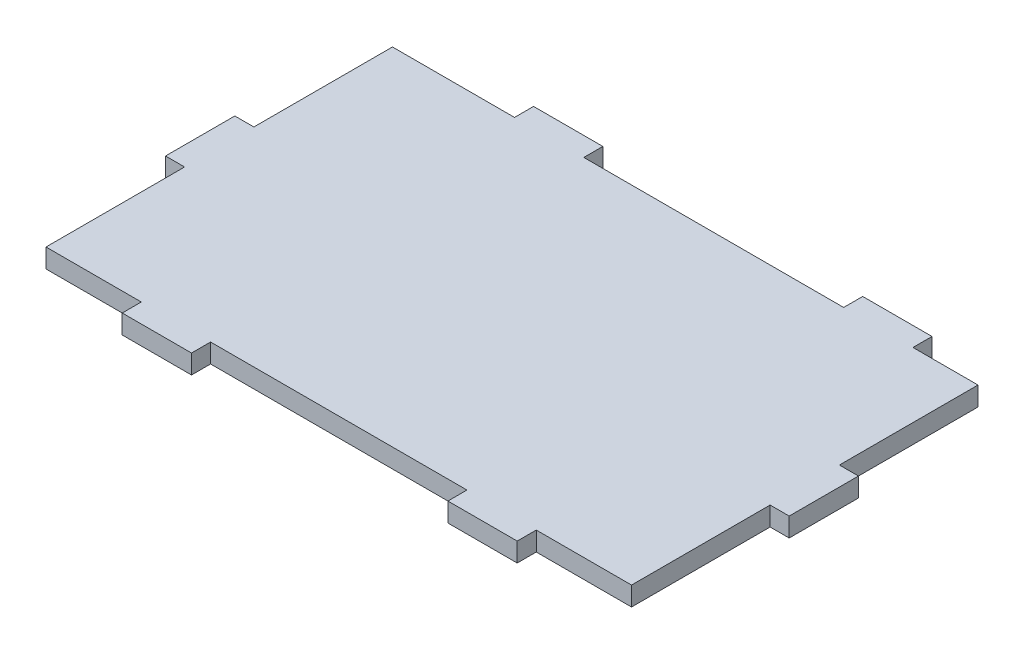
ISO-10303-21;
HEADER;
FILE_DESCRIPTION(('STEP AP214'),'2;1');
FILE_NAME('part.step','',(''),(''),'','','');
FILE_SCHEMA(('AUTOMOTIVE_DESIGN { 1 0 10303 214 1 1 1 1 }'));
ENDSEC;
DATA;
#1=APPLICATION_CONTEXT('core data for automotive mechanical design processes');
#2=APPLICATION_PROTOCOL_DEFINITION('international standard','automotive_design',2000,#1);
#3=PRODUCT_CONTEXT('',#1,'mechanical');
#4=PRODUCT('Part','Part','',(#3));
#5=PRODUCT_RELATED_PRODUCT_CATEGORY('part','',(#4));
#6=PRODUCT_DEFINITION_FORMATION('','',#4);
#7=PRODUCT_DEFINITION_CONTEXT('part definition',#1,'design');
#8=PRODUCT_DEFINITION('design','',#6,#7);
#9=PRODUCT_DEFINITION_SHAPE('','',#8);
#10=(LENGTH_UNIT() NAMED_UNIT(*) SI_UNIT(.MILLI.,.METRE.));
#11=(NAMED_UNIT(*) PLANE_ANGLE_UNIT() SI_UNIT($,.RADIAN.));
#12=(NAMED_UNIT(*) SI_UNIT($,.STERADIAN.) SOLID_ANGLE_UNIT());
#13=UNCERTAINTY_MEASURE_WITH_UNIT(LENGTH_MEASURE(1.E-05),#10,'distance_accuracy_value','');
#14=(GEOMETRIC_REPRESENTATION_CONTEXT(3) GLOBAL_UNCERTAINTY_ASSIGNED_CONTEXT((#13)) GLOBAL_UNIT_ASSIGNED_CONTEXT((#10,
#11,#12)) REPRESENTATION_CONTEXT('',''));
#15=CARTESIAN_POINT('',(0.,0.,0.));
#16=DIRECTION('',(0.,0.,1.));
#17=DIRECTION('',(1.,0.,0.));
#18=AXIS2_PLACEMENT_3D('',#15,#16,#17);
#19=CARTESIAN_POINT('',(180.,5.5,0.));
#20=DIRECTION('',(1.,0.,0.));
#21=DIRECTION('',(0.,0.,-1.));
#22=AXIS2_PLACEMENT_3D('',#19,#20,#21);
#23=PLANE('',#22);
#24=DIRECTION('',(0.,0.,1.));
#25=VECTOR('',#24,1.);
#26=CARTESIAN_POINT('',(180.,0.,0.));
#27=LINE('',#26,#25);
#28=CARTESIAN_POINT('',(180.,0.,-64.4999999999886));
#29=VERTEX_POINT('',#28);
#30=CARTESIAN_POINT('',(180.,0.,-44.4999999999886));
#31=VERTEX_POINT('',#30);
#32=EDGE_CURVE('E259',#29,#31,#27,.T.);
#33=ORIENTED_EDGE('',*,*,#32,.F.);
#34=DIRECTION('',(0.,-1.,0.));
#35=VECTOR('',#34,1.);
#36=CARTESIAN_POINT('',(180.,5.5,-64.4999999999886));
#37=LINE('',#36,#35);
#38=CARTESIAN_POINT('',(180.,5.5,-64.4999999999886));
#39=VERTEX_POINT('',#38);
#40=EDGE_CURVE('E11',#39,#29,#37,.T.);
#41=ORIENTED_EDGE('',*,*,#40,.F.);
#42=DIRECTION('',(0.,0.,1.));
#43=VECTOR('',#42,1.);
#44=CARTESIAN_POINT('',(180.,5.5,0.));
#45=LINE('',#44,#43);
#46=CARTESIAN_POINT('',(180.,5.5,-44.4999999999886));
#47=VERTEX_POINT('',#46);
#48=EDGE_CURVE('E333',#39,#47,#45,.T.);
#49=ORIENTED_EDGE('',*,*,#48,.T.);
#50=DIRECTION('',(0.,-1.,0.));
#51=VECTOR('',#50,1.);
#52=CARTESIAN_POINT('',(180.,5.5,-44.4999999999886));
#53=LINE('',#52,#51);
#54=EDGE_CURVE('E158',#47,#31,#53,.T.);
#55=ORIENTED_EDGE('',*,*,#54,.T.);
#56=EDGE_LOOP('',(#33,#41,#49,#55));
#57=FACE_BOUND('',#56,.T.);
#58=ADVANCED_FACE('F47',(#57),#23,.T.);
#59=CARTESIAN_POINT('',(0.,5.5,-64.4999999999886));
#60=DIRECTION('',(0.,0.,-1.));
#61=DIRECTION('',(-1.,0.,0.));
#62=AXIS2_PLACEMENT_3D('',#59,#60,#61);
#63=PLANE('',#62);
#64=DIRECTION('',(1.,0.,0.));
#65=VECTOR('',#64,1.);
#66=CARTESIAN_POINT('',(0.,0.,-64.4999999999886));
#67=LINE('',#66,#65);
#68=CARTESIAN_POINT('',(174.5,0.,-64.4999999999886));
#69=VERTEX_POINT('',#68);
#70=EDGE_CURVE('E262',#69,#29,#67,.T.);
#71=ORIENTED_EDGE('',*,*,#70,.F.);
#72=DIRECTION('',(0.,-1.,0.));
#73=VECTOR('',#72,1.);
#74=CARTESIAN_POINT('',(174.5,5.5,-64.4999999999886));
#75=LINE('',#74,#73);
#76=CARTESIAN_POINT('',(174.5,5.5,-64.4999999999886));
#77=VERTEX_POINT('',#76);
#78=EDGE_CURVE('E55',#77,#69,#75,.T.);
#79=ORIENTED_EDGE('',*,*,#78,.F.);
#80=DIRECTION('',(1.,0.,0.));
#81=VECTOR('',#80,1.);
#82=CARTESIAN_POINT('',(0.,5.5,-64.4999999999886));
#83=LINE('',#82,#81);
#84=EDGE_CURVE('E398',#77,#39,#83,.T.);
#85=ORIENTED_EDGE('',*,*,#84,.T.);
#86=ORIENTED_EDGE('',*,*,#40,.T.);
#87=EDGE_LOOP('',(#71,#79,#85,#86));
#88=FACE_BOUND('',#87,.T.);
#89=ADVANCED_FACE('F397',(#88),#63,.T.);
#90=CARTESIAN_POINT('',(174.5,5.5,0.));
#91=DIRECTION('',(-1.,0.,0.));
#92=DIRECTION('',(0.,0.,1.));
#93=AXIS2_PLACEMENT_3D('',#90,#91,#92);
#94=PLANE('',#93);
#95=DIRECTION('',(0.,0.,-1.));
#96=VECTOR('',#95,1.);
#97=CARTESIAN_POINT('',(174.5,0.,0.));
#98=LINE('',#97,#96);
#99=CARTESIAN_POINT('',(174.5,0.,-104.499999999989));
#100=VERTEX_POINT('',#99);
#101=EDGE_CURVE('E265',#69,#100,#98,.T.);
#102=ORIENTED_EDGE('',*,*,#101,.T.);
#103=DIRECTION('',(0.,-1.,0.));
#104=VECTOR('',#103,1.);
#105=CARTESIAN_POINT('',(174.5,5.5,-104.499999999989));
#106=LINE('',#105,#104);
#107=CARTESIAN_POINT('',(174.5,5.5,-104.499999999989));
#108=VERTEX_POINT('',#107);
#109=EDGE_CURVE('E383',#108,#100,#106,.T.);
#110=ORIENTED_EDGE('',*,*,#109,.F.);
#111=DIRECTION('',(0.,0.,-1.));
#112=VECTOR('',#111,1.);
#113=CARTESIAN_POINT('',(174.5,5.5,0.));
#114=LINE('',#113,#112);
#115=EDGE_CURVE('E389',#77,#108,#114,.T.);
#116=ORIENTED_EDGE('',*,*,#115,.F.);
#117=ORIENTED_EDGE('',*,*,#78,.T.);
#118=EDGE_LOOP('',(#102,#110,#116,#117));
#119=FACE_BOUND('',#118,.T.);
#120=ADVANCED_FACE('F387',(#119),#94,.F.);
#121=CARTESIAN_POINT('',(6.17924532798637E-12,5.5,-104.499999999999));
#122=DIRECTION('',(0.,0.,-1.));
#123=DIRECTION('',(-1.,0.,0.));
#124=AXIS2_PLACEMENT_3D('',#121,#122,#123);
#125=PLANE('',#124);
#126=DIRECTION('',(1.,0.,0.));
#127=VECTOR('',#126,1.);
#128=CARTESIAN_POINT('',(6.17924532798637E-12,0.,-104.499999999999));
#129=LINE('',#128,#127);
#130=CARTESIAN_POINT('',(155.724518543086,0.,-104.49999999999));
#131=VERTEX_POINT('',#130);
#132=EDGE_CURVE('E268',#131,#100,#129,.T.);
#133=ORIENTED_EDGE('',*,*,#132,.F.);
#134=DIRECTION('',(0.,-1.,0.));
#135=VECTOR('',#134,1.);
#136=CARTESIAN_POINT('',(155.724518543086,5.5,-104.49999999999));
#137=LINE('',#136,#135);
#138=CARTESIAN_POINT('',(155.724518543086,5.5,-104.49999999999));
#139=VERTEX_POINT('',#138);
#140=EDGE_CURVE('E381',#139,#131,#137,.T.);
#141=ORIENTED_EDGE('',*,*,#140,.F.);
#142=DIRECTION('',(1.,0.,0.));
#143=VECTOR('',#142,1.);
#144=CARTESIAN_POINT('',(6.17924532798637E-12,5.5,-104.499999999999));
#145=LINE('',#144,#143);
#146=EDGE_CURVE('E406',#139,#108,#145,.T.);
#147=ORIENTED_EDGE('',*,*,#146,.T.);
#148=ORIENTED_EDGE('',*,*,#109,.T.);
#149=EDGE_LOOP('',(#133,#141,#147,#148));
#150=FACE_BOUND('',#149,.T.);
#151=ADVANCED_FACE('F552',(#150),#125,.T.);
#152=CARTESIAN_POINT('',(155.724518543086,5.5,0.));
#153=DIRECTION('',(1.,0.,0.));
#154=DIRECTION('',(0.,0.,-1.));
#155=AXIS2_PLACEMENT_3D('',#152,#153,#154);
#156=PLANE('',#155);
#157=DIRECTION('',(0.,0.,1.));
#158=VECTOR('',#157,1.);
#159=CARTESIAN_POINT('',(155.724518543086,0.,0.));
#160=LINE('',#159,#158);
#161=CARTESIAN_POINT('',(155.724518543086,0.,-109.99999999999));
#162=VERTEX_POINT('',#161);
#163=EDGE_CURVE('E271',#162,#131,#160,.T.);
#164=ORIENTED_EDGE('',*,*,#163,.F.);
#165=DIRECTION('',(0.,-1.,0.));
#166=VECTOR('',#165,1.);
#167=CARTESIAN_POINT('',(155.724518543086,5.5,-109.99999999999));
#168=LINE('',#167,#166);
#169=CARTESIAN_POINT('',(155.724518543086,5.5,-109.99999999999));
#170=VERTEX_POINT('',#169);
#171=EDGE_CURVE('E379',#170,#162,#168,.T.);
#172=ORIENTED_EDGE('',*,*,#171,.F.);
#173=DIRECTION('',(0.,0.,1.));
#174=VECTOR('',#173,1.);
#175=CARTESIAN_POINT('',(155.724518543086,5.5,0.));
#176=LINE('',#175,#174);
#177=EDGE_CURVE('E409',#170,#139,#176,.T.);
#178=ORIENTED_EDGE('',*,*,#177,.T.);
#179=ORIENTED_EDGE('',*,*,#140,.T.);
#180=EDGE_LOOP('',(#164,#172,#178,#179));
#181=FACE_BOUND('',#180,.T.);
#182=ADVANCED_FACE('F549',(#181),#156,.T.);
#183=CARTESIAN_POINT('',(0.,5.5,-109.99999999999));
#184=DIRECTION('',(0.,0.,-1.));
#185=DIRECTION('',(-1.,0.,0.));
#186=AXIS2_PLACEMENT_3D('',#183,#184,#185);
#187=PLANE('',#186);
#188=DIRECTION('',(1.,0.,0.));
#189=VECTOR('',#188,1.);
#190=CARTESIAN_POINT('',(0.,0.,-109.99999999999));
#191=LINE('',#190,#189);
#192=CARTESIAN_POINT('',(135.724518543086,0.,-109.99999999999));
#193=VERTEX_POINT('',#192);
#194=EDGE_CURVE('E274',#193,#162,#191,.T.);
#195=ORIENTED_EDGE('',*,*,#194,.F.);
#196=DIRECTION('',(0.,-1.,0.));
#197=VECTOR('',#196,1.);
#198=CARTESIAN_POINT('',(135.724518543086,5.5,-109.99999999999));
#199=LINE('',#198,#197);
#200=CARTESIAN_POINT('',(135.724518543086,5.5,-109.99999999999));
#201=VERTEX_POINT('',#200);
#202=EDGE_CURVE('E377',#201,#193,#199,.T.);
#203=ORIENTED_EDGE('',*,*,#202,.F.);
#204=DIRECTION('',(1.,0.,0.));
#205=VECTOR('',#204,1.);
#206=CARTESIAN_POINT('',(0.,5.5,-109.99999999999));
#207=LINE('',#206,#205);
#208=EDGE_CURVE('E412',#201,#170,#207,.T.);
#209=ORIENTED_EDGE('',*,*,#208,.T.);
#210=ORIENTED_EDGE('',*,*,#171,.T.);
#211=EDGE_LOOP('',(#195,#203,#209,#210));
#212=FACE_BOUND('',#211,.T.);
#213=ADVANCED_FACE('F544',(#212),#187,.T.);
#214=CARTESIAN_POINT('',(135.724518543086,5.5,0.));
#215=DIRECTION('',(1.,0.,0.));
#216=DIRECTION('',(0.,0.,-1.));
#217=AXIS2_PLACEMENT_3D('',#214,#215,#216);
#218=PLANE('',#217);
#219=DIRECTION('',(0.,0.,1.));
#220=VECTOR('',#219,1.);
#221=CARTESIAN_POINT('',(135.724518543086,0.,0.));
#222=LINE('',#221,#220);
#223=CARTESIAN_POINT('',(135.724518543086,0.,-104.49999999999));
#224=VERTEX_POINT('',#223);
#225=EDGE_CURVE('E277',#193,#224,#222,.T.);
#226=ORIENTED_EDGE('',*,*,#225,.T.);
#227=DIRECTION('',(0.,-1.,0.));
#228=VECTOR('',#227,1.);
#229=CARTESIAN_POINT('',(135.724518543086,5.5,-104.49999999999));
#230=LINE('',#229,#228);
#231=CARTESIAN_POINT('',(135.724518543086,5.5,-104.49999999999));
#232=VERTEX_POINT('',#231);
#233=EDGE_CURVE('E375',#232,#224,#230,.T.);
#234=ORIENTED_EDGE('',*,*,#233,.F.);
#235=DIRECTION('',(0.,0.,1.));
#236=VECTOR('',#235,1.);
#237=CARTESIAN_POINT('',(135.724518543086,5.5,0.));
#238=LINE('',#237,#236);
#239=EDGE_CURVE('E415',#201,#232,#238,.T.);
#240=ORIENTED_EDGE('',*,*,#239,.F.);
#241=ORIENTED_EDGE('',*,*,#202,.T.);
#242=EDGE_LOOP('',(#226,#234,#240,#241));
#243=FACE_BOUND('',#242,.T.);
#244=ADVANCED_FACE('F541',(#243),#218,.F.);
#245=CARTESIAN_POINT('',(0.,5.5,-104.49999999999));
#246=DIRECTION('',(0.,0.,-1.));
#247=DIRECTION('',(-1.,0.,0.));
#248=AXIS2_PLACEMENT_3D('',#245,#246,#247);
#249=PLANE('',#248);
#250=DIRECTION('',(1.,0.,0.));
#251=VECTOR('',#250,1.);
#252=CARTESIAN_POINT('',(0.,0.,-104.49999999999));
#253=LINE('',#252,#251);
#254=CARTESIAN_POINT('',(60.7245185430864,0.,-104.49999999999));
#255=VERTEX_POINT('',#254);
#256=EDGE_CURVE('E280',#255,#224,#253,.T.);
#257=ORIENTED_EDGE('',*,*,#256,.F.);
#258=DIRECTION('',(0.,-1.,0.));
#259=VECTOR('',#258,1.);
#260=CARTESIAN_POINT('',(60.7245185430864,5.5,-104.49999999999));
#261=LINE('',#260,#259);
#262=CARTESIAN_POINT('',(60.7245185430864,5.5,-104.49999999999));
#263=VERTEX_POINT('',#262);
#264=EDGE_CURVE('E373',#263,#255,#261,.T.);
#265=ORIENTED_EDGE('',*,*,#264,.F.);
#266=DIRECTION('',(1.,0.,0.));
#267=VECTOR('',#266,1.);
#268=CARTESIAN_POINT('',(0.,5.5,-104.49999999999));
#269=LINE('',#268,#267);
#270=EDGE_CURVE('E417',#263,#232,#269,.T.);
#271=ORIENTED_EDGE('',*,*,#270,.T.);
#272=ORIENTED_EDGE('',*,*,#233,.T.);
#273=EDGE_LOOP('',(#257,#265,#271,#272));
#274=FACE_BOUND('',#273,.T.);
#275=ADVANCED_FACE('F537',(#274),#249,.T.);
#276=CARTESIAN_POINT('',(60.7245185430864,5.5,0.));
#277=DIRECTION('',(1.,0.,0.));
#278=DIRECTION('',(0.,0.,-1.));
#279=AXIS2_PLACEMENT_3D('',#276,#277,#278);
#280=PLANE('',#279);
#281=DIRECTION('',(0.,0.,1.));
#282=VECTOR('',#281,1.);
#283=CARTESIAN_POINT('',(60.7245185430864,0.,0.));
#284=LINE('',#283,#282);
#285=CARTESIAN_POINT('',(60.7245185430864,0.,-109.99999999999));
#286=VERTEX_POINT('',#285);
#287=EDGE_CURVE('E283',#286,#255,#284,.T.);
#288=ORIENTED_EDGE('',*,*,#287,.F.);
#289=DIRECTION('',(0.,-1.,0.));
#290=VECTOR('',#289,1.);
#291=CARTESIAN_POINT('',(60.7245185430864,5.5,-109.99999999999));
#292=LINE('',#291,#290);
#293=CARTESIAN_POINT('',(60.7245185430864,5.5,-109.99999999999));
#294=VERTEX_POINT('',#293);
#295=EDGE_CURVE('E371',#294,#286,#292,.T.);
#296=ORIENTED_EDGE('',*,*,#295,.F.);
#297=DIRECTION('',(0.,0.,1.));
#298=VECTOR('',#297,1.);
#299=CARTESIAN_POINT('',(60.7245185430864,5.5,0.));
#300=LINE('',#299,#298);
#301=EDGE_CURVE('E420',#294,#263,#300,.T.);
#302=ORIENTED_EDGE('',*,*,#301,.T.);
#303=ORIENTED_EDGE('',*,*,#264,.T.);
#304=EDGE_LOOP('',(#288,#296,#302,#303));
#305=FACE_BOUND('',#304,.T.);
#306=ADVANCED_FACE('F533',(#305),#280,.T.);
#307=CARTESIAN_POINT('',(0.,5.5,-109.99999999999));
#308=DIRECTION('',(0.,0.,-1.));
#309=DIRECTION('',(-1.,0.,0.));
#310=AXIS2_PLACEMENT_3D('',#307,#308,#309);
#311=PLANE('',#310);
#312=DIRECTION('',(1.,0.,0.));
#313=VECTOR('',#312,1.);
#314=CARTESIAN_POINT('',(0.,0.,-109.99999999999));
#315=LINE('',#314,#313);
#316=CARTESIAN_POINT('',(40.7245185430864,0.,-109.99999999999));
#317=VERTEX_POINT('',#316);
#318=EDGE_CURVE('E286',#317,#286,#315,.T.);
#319=ORIENTED_EDGE('',*,*,#318,.F.);
#320=DIRECTION('',(0.,-1.,0.));
#321=VECTOR('',#320,1.);
#322=CARTESIAN_POINT('',(40.7245185430864,5.5,-109.99999999999));
#323=LINE('',#322,#321);
#324=CARTESIAN_POINT('',(40.7245185430864,5.5,-109.99999999999));
#325=VERTEX_POINT('',#324);
#326=EDGE_CURVE('E369',#325,#317,#323,.T.);
#327=ORIENTED_EDGE('',*,*,#326,.F.);
#328=DIRECTION('',(1.,0.,0.));
#329=VECTOR('',#328,1.);
#330=CARTESIAN_POINT('',(0.,5.5,-109.99999999999));
#331=LINE('',#330,#329);
#332=EDGE_CURVE('E423',#325,#294,#331,.T.);
#333=ORIENTED_EDGE('',*,*,#332,.T.);
#334=ORIENTED_EDGE('',*,*,#295,.T.);
#335=EDGE_LOOP('',(#319,#327,#333,#334));
#336=FACE_BOUND('',#335,.T.);
#337=ADVANCED_FACE('F528',(#336),#311,.T.);
#338=CARTESIAN_POINT('',(40.7245185430864,5.5,0.));
#339=DIRECTION('',(1.,0.,0.));
#340=DIRECTION('',(0.,0.,-1.));
#341=AXIS2_PLACEMENT_3D('',#338,#339,#340);
#342=PLANE('',#341);
#343=DIRECTION('',(0.,0.,1.));
#344=VECTOR('',#343,1.);
#345=CARTESIAN_POINT('',(40.7245185430864,0.,0.));
#346=LINE('',#345,#344);
#347=CARTESIAN_POINT('',(40.7245185430864,0.,-104.49999999999));
#348=VERTEX_POINT('',#347);
#349=EDGE_CURVE('E289',#317,#348,#346,.T.);
#350=ORIENTED_EDGE('',*,*,#349,.T.);
#351=DIRECTION('',(0.,-1.,0.));
#352=VECTOR('',#351,1.);
#353=CARTESIAN_POINT('',(40.7245185430864,5.5,-104.49999999999));
#354=LINE('',#353,#352);
#355=CARTESIAN_POINT('',(40.7245185430864,5.5,-104.49999999999));
#356=VERTEX_POINT('',#355);
#357=EDGE_CURVE('E367',#356,#348,#354,.T.);
#358=ORIENTED_EDGE('',*,*,#357,.F.);
#359=DIRECTION('',(0.,0.,1.));
#360=VECTOR('',#359,1.);
#361=CARTESIAN_POINT('',(40.7245185430864,5.5,0.));
#362=LINE('',#361,#360);
#363=EDGE_CURVE('E426',#325,#356,#362,.T.);
#364=ORIENTED_EDGE('',*,*,#363,.F.);
#365=ORIENTED_EDGE('',*,*,#326,.T.);
#366=EDGE_LOOP('',(#350,#358,#364,#365));
#367=FACE_BOUND('',#366,.T.);
#368=ADVANCED_FACE('F525',(#367),#342,.F.);
#369=CARTESIAN_POINT('',(-3.29368039286054E-12,5.5,-104.499999999989));
#370=DIRECTION('',(0.,0.,-1.));
#371=DIRECTION('',(-1.,0.,0.));
#372=AXIS2_PLACEMENT_3D('',#369,#370,#371);
#373=PLANE('',#372);
#374=DIRECTION('',(1.,0.,0.));
#375=VECTOR('',#374,1.);
#376=CARTESIAN_POINT('',(-3.29368039286054E-12,0.,-104.499999999989));
#377=LINE('',#376,#375);
#378=CARTESIAN_POINT('',(5.49999999999998,0.,-104.499999999989));
#379=VERTEX_POINT('',#378);
#380=EDGE_CURVE('E292',#379,#348,#377,.T.);
#381=ORIENTED_EDGE('',*,*,#380,.F.);
#382=DIRECTION('',(0.,-1.,0.));
#383=VECTOR('',#382,1.);
#384=CARTESIAN_POINT('',(5.49999999999998,5.5,-104.499999999989));
#385=LINE('',#384,#383);
#386=CARTESIAN_POINT('',(5.49999999999998,5.5,-104.499999999989));
#387=VERTEX_POINT('',#386);
#388=EDGE_CURVE('E365',#387,#379,#385,.T.);
#389=ORIENTED_EDGE('',*,*,#388,.F.);
#390=DIRECTION('',(1.,0.,0.));
#391=VECTOR('',#390,1.);
#392=CARTESIAN_POINT('',(-3.29368039286054E-12,5.5,-104.499999999989));
#393=LINE('',#392,#391);
#394=EDGE_CURVE('E428',#387,#356,#393,.T.);
#395=ORIENTED_EDGE('',*,*,#394,.T.);
#396=ORIENTED_EDGE('',*,*,#357,.T.);
#397=EDGE_LOOP('',(#381,#389,#395,#396));
#398=FACE_BOUND('',#397,.T.);
#399=ADVANCED_FACE('F520',(#398),#373,.T.);
#400=CARTESIAN_POINT('',(5.49999999999997,5.5,0.));
#401=DIRECTION('',(-1.,0.,0.));
#402=DIRECTION('',(0.,0.,1.));
#403=AXIS2_PLACEMENT_3D('',#400,#401,#402);
#404=PLANE('',#403);
#405=DIRECTION('',(0.,0.,-1.));
#406=VECTOR('',#405,1.);
#407=CARTESIAN_POINT('',(5.49999999999997,0.,0.));
#408=LINE('',#407,#406);
#409=CARTESIAN_POINT('',(5.49999999999997,0.,-64.4999999999886));
#410=VERTEX_POINT('',#409);
#411=EDGE_CURVE('E295',#410,#379,#408,.T.);
#412=ORIENTED_EDGE('',*,*,#411,.F.);
#413=DIRECTION('',(0.,-1.,0.));
#414=VECTOR('',#413,1.);
#415=CARTESIAN_POINT('',(5.49999999999997,5.5,-64.4999999999886));
#416=LINE('',#415,#414);
#417=CARTESIAN_POINT('',(5.49999999999997,5.5,-64.4999999999886));
#418=VERTEX_POINT('',#417);
#419=EDGE_CURVE('E363',#418,#410,#416,.T.);
#420=ORIENTED_EDGE('',*,*,#419,.F.);
#421=DIRECTION('',(0.,0.,-1.));
#422=VECTOR('',#421,1.);
#423=CARTESIAN_POINT('',(5.49999999999997,5.5,0.));
#424=LINE('',#423,#422);
#425=EDGE_CURVE('E431',#418,#387,#424,.T.);
#426=ORIENTED_EDGE('',*,*,#425,.T.);
#427=ORIENTED_EDGE('',*,*,#388,.T.);
#428=EDGE_LOOP('',(#412,#420,#426,#427));
#429=FACE_BOUND('',#428,.T.);
#430=ADVANCED_FACE('F515',(#429),#404,.T.);
#431=CARTESIAN_POINT('',(0.,5.5,-64.4999999999886));
#432=DIRECTION('',(0.,0.,1.));
#433=DIRECTION('',(1.,0.,0.));
#434=AXIS2_PLACEMENT_3D('',#431,#432,#433);
#435=PLANE('',#434);
#436=DIRECTION('',(-1.,0.,0.));
#437=VECTOR('',#436,1.);
#438=CARTESIAN_POINT('',(0.,0.,-64.4999999999886));
#439=LINE('',#438,#437);
#440=CARTESIAN_POINT('',(0.,0.,-64.4999999999886));
#441=VERTEX_POINT('',#440);
#442=EDGE_CURVE('E298',#410,#441,#439,.T.);
#443=ORIENTED_EDGE('',*,*,#442,.T.);
#444=DIRECTION('',(0.,-1.,0.));
#445=VECTOR('',#444,1.);
#446=CARTESIAN_POINT('',(0.,5.5,-64.4999999999886));
#447=LINE('',#446,#445);
#448=CARTESIAN_POINT('',(0.,5.5,-64.4999999999886));
#449=VERTEX_POINT('',#448);
#450=EDGE_CURVE('E360',#449,#441,#447,.T.);
#451=ORIENTED_EDGE('',*,*,#450,.F.);
#452=DIRECTION('',(-1.,0.,0.));
#453=VECTOR('',#452,1.);
#454=CARTESIAN_POINT('',(0.,5.5,-64.4999999999886));
#455=LINE('',#454,#453);
#456=EDGE_CURVE('E434',#418,#449,#455,.T.);
#457=ORIENTED_EDGE('',*,*,#456,.F.);
#458=ORIENTED_EDGE('',*,*,#419,.T.);
#459=EDGE_LOOP('',(#443,#451,#457,#458));
#460=FACE_BOUND('',#459,.T.);
#461=ADVANCED_FACE('F512',(#460),#435,.F.);
#462=CARTESIAN_POINT('',(0.,5.5,0.));
#463=DIRECTION('',(1.,0.,0.));
#464=DIRECTION('',(0.,0.,-1.));
#465=AXIS2_PLACEMENT_3D('',#462,#463,#464);
#466=PLANE('',#465);
#467=DIRECTION('',(0.,0.,1.));
#468=VECTOR('',#467,1.);
#469=CARTESIAN_POINT('',(0.,0.,0.));
#470=LINE('',#469,#468);
#471=CARTESIAN_POINT('',(0.,0.,-44.4999999999886));
#472=VERTEX_POINT('',#471);
#473=EDGE_CURVE('E300',#441,#472,#470,.T.);
#474=ORIENTED_EDGE('',*,*,#473,.T.);
#475=DIRECTION('',(0.,-1.,0.));
#476=VECTOR('',#475,1.);
#477=CARTESIAN_POINT('',(0.,5.5,-44.4999999999886));
#478=LINE('',#477,#476);
#479=CARTESIAN_POINT('',(0.,5.5,-44.4999999999886));
#480=VERTEX_POINT('',#479);
#481=EDGE_CURVE('E358',#480,#472,#478,.T.);
#482=ORIENTED_EDGE('',*,*,#481,.F.);
#483=DIRECTION('',(0.,0.,1.));
#484=VECTOR('',#483,1.);
#485=CARTESIAN_POINT('',(0.,5.5,0.));
#486=LINE('',#485,#484);
#487=EDGE_CURVE('E436',#449,#480,#486,.T.);
#488=ORIENTED_EDGE('',*,*,#487,.F.);
#489=ORIENTED_EDGE('',*,*,#450,.T.);
#490=EDGE_LOOP('',(#474,#482,#488,#489));
#491=FACE_BOUND('',#490,.T.);
#492=ADVANCED_FACE('F507',(#491),#466,.F.);
#493=CARTESIAN_POINT('',(0.,5.5,-44.4999999999886));
#494=DIRECTION('',(0.,0.,1.));
#495=DIRECTION('',(1.,0.,0.));
#496=AXIS2_PLACEMENT_3D('',#493,#494,#495);
#497=PLANE('',#496);
#498=DIRECTION('',(-1.,0.,0.));
#499=VECTOR('',#498,1.);
#500=CARTESIAN_POINT('',(0.,0.,-44.4999999999886));
#501=LINE('',#500,#499);
#502=CARTESIAN_POINT('',(5.49999999999997,0.,-44.4999999999886));
#503=VERTEX_POINT('',#502);
#504=EDGE_CURVE('E303',#503,#472,#501,.T.);
#505=ORIENTED_EDGE('',*,*,#504,.F.);
#506=DIRECTION('',(0.,-1.,0.));
#507=VECTOR('',#506,1.);
#508=CARTESIAN_POINT('',(5.49999999999997,5.5,-44.4999999999886));
#509=LINE('',#508,#507);
#510=CARTESIAN_POINT('',(5.49999999999997,5.5,-44.4999999999886));
#511=VERTEX_POINT('',#510);
#512=EDGE_CURVE('E356',#511,#503,#509,.T.);
#513=ORIENTED_EDGE('',*,*,#512,.F.);
#514=DIRECTION('',(-1.,0.,0.));
#515=VECTOR('',#514,1.);
#516=CARTESIAN_POINT('',(0.,5.5,-44.4999999999886));
#517=LINE('',#516,#515);
#518=EDGE_CURVE('E438',#511,#480,#517,.T.);
#519=ORIENTED_EDGE('',*,*,#518,.T.);
#520=ORIENTED_EDGE('',*,*,#481,.T.);
#521=EDGE_LOOP('',(#505,#513,#519,#520));
#522=FACE_BOUND('',#521,.T.);
#523=ADVANCED_FACE('F501',(#522),#497,.T.);
#524=CARTESIAN_POINT('',(5.49999999999998,5.5,0.));
#525=DIRECTION('',(-1.,0.,0.));
#526=DIRECTION('',(0.,0.,1.));
#527=AXIS2_PLACEMENT_3D('',#524,#525,#526);
#528=PLANE('',#527);
#529=DIRECTION('',(0.,0.,-1.));
#530=VECTOR('',#529,1.);
#531=CARTESIAN_POINT('',(5.49999999999998,0.,0.));
#532=LINE('',#531,#530);
#533=CARTESIAN_POINT('',(5.49999999999998,0.,-4.49999999998833));
#534=VERTEX_POINT('',#533);
#535=EDGE_CURVE('E306',#534,#503,#532,.T.);
#536=ORIENTED_EDGE('',*,*,#535,.F.);
#537=DIRECTION('',(0.,-1.,0.));
#538=VECTOR('',#537,1.);
#539=CARTESIAN_POINT('',(5.49999999999998,5.5,-4.49999999998833));
#540=LINE('',#539,#538);
#541=CARTESIAN_POINT('',(5.49999999999998,5.5,-4.49999999998833));
#542=VERTEX_POINT('',#541);
#543=EDGE_CURVE('E354',#542,#534,#540,.T.);
#544=ORIENTED_EDGE('',*,*,#543,.F.);
#545=DIRECTION('',(0.,0.,-1.));
#546=VECTOR('',#545,1.);
#547=CARTESIAN_POINT('',(5.49999999999998,5.5,0.));
#548=LINE('',#547,#546);
#549=EDGE_CURVE('E441',#542,#511,#548,.T.);
#550=ORIENTED_EDGE('',*,*,#549,.T.);
#551=ORIENTED_EDGE('',*,*,#512,.T.);
#552=EDGE_LOOP('',(#536,#544,#550,#551));
#553=FACE_BOUND('',#552,.T.);
#554=ADVANCED_FACE('F495',(#553),#528,.T.);
#555=CARTESIAN_POINT('',(0.,5.5,-4.49999999998828));
#556=DIRECTION('',(0.,0.,-1.));
#557=DIRECTION('',(-1.,0.,0.));
#558=AXIS2_PLACEMENT_3D('',#555,#556,#557);
#559=PLANE('',#558);
#560=DIRECTION('',(1.,0.,0.));
#561=VECTOR('',#560,1.);
#562=CARTESIAN_POINT('',(0.,0.,-4.49999999998828));
#563=LINE('',#562,#561);
#564=CARTESIAN_POINT('',(32.9999999999999,0.,-4.49999999998855));
#565=VERTEX_POINT('',#564);
#566=EDGE_CURVE('E309',#534,#565,#563,.T.);
#567=ORIENTED_EDGE('',*,*,#566,.T.);
#568=DIRECTION('',(0.,-1.,0.));
#569=VECTOR('',#568,1.);
#570=CARTESIAN_POINT('',(32.9999999999999,5.5,-4.49999999998855));
#571=LINE('',#570,#569);
#572=CARTESIAN_POINT('',(32.9999999999999,5.5,-4.49999999998855));
#573=VERTEX_POINT('',#572);
#574=EDGE_CURVE('E352',#573,#565,#571,.T.);
#575=ORIENTED_EDGE('',*,*,#574,.F.);
#576=DIRECTION('',(1.,0.,0.));
#577=VECTOR('',#576,1.);
#578=CARTESIAN_POINT('',(0.,5.5,-4.49999999998828));
#579=LINE('',#578,#577);
#580=EDGE_CURVE('E444',#542,#573,#579,.T.);
#581=ORIENTED_EDGE('',*,*,#580,.F.);
#582=ORIENTED_EDGE('',*,*,#543,.T.);
#583=EDGE_LOOP('',(#567,#575,#581,#582));
#584=FACE_BOUND('',#583,.T.);
#585=ADVANCED_FACE('F553',(#584),#559,.F.);
#586=CARTESIAN_POINT('',(32.9999999999999,5.5,0.));
#587=DIRECTION('',(-1.,0.,0.));
#588=DIRECTION('',(0.,0.,1.));
#589=AXIS2_PLACEMENT_3D('',#586,#587,#588);
#590=PLANE('',#589);
#591=DIRECTION('',(0.,0.,-1.));
#592=VECTOR('',#591,1.);
#593=CARTESIAN_POINT('',(32.9999999999999,0.,0.));
#594=LINE('',#593,#592);
#595=CARTESIAN_POINT('',(32.9999999999999,0.,1.00000000001145));
#596=VERTEX_POINT('',#595);
#597=EDGE_CURVE('E312',#596,#565,#594,.T.);
#598=ORIENTED_EDGE('',*,*,#597,.F.);
#599=DIRECTION('',(0.,-1.,0.));
#600=VECTOR('',#599,1.);
#601=CARTESIAN_POINT('',(32.9999999999999,5.5,1.00000000001145));
#602=LINE('',#601,#600);
#603=CARTESIAN_POINT('',(32.9999999999999,5.5,1.00000000001145));
#604=VERTEX_POINT('',#603);
#605=EDGE_CURVE('E350',#604,#596,#602,.T.);
#606=ORIENTED_EDGE('',*,*,#605,.F.);
#607=DIRECTION('',(0.,0.,-1.));
#608=VECTOR('',#607,1.);
#609=CARTESIAN_POINT('',(32.9999999999999,5.5,0.));
#610=LINE('',#609,#608);
#611=EDGE_CURVE('E446',#604,#573,#610,.T.);
#612=ORIENTED_EDGE('',*,*,#611,.T.);
#613=ORIENTED_EDGE('',*,*,#574,.T.);
#614=EDGE_LOOP('',(#598,#606,#612,#613));
#615=FACE_BOUND('',#614,.T.);
#616=ADVANCED_FACE('F489',(#615),#590,.T.);
#617=CARTESIAN_POINT('',(0.,5.5,1.00000000001145));
#618=DIRECTION('',(0.,0.,-1.));
#619=DIRECTION('',(-1.,0.,0.));
#620=AXIS2_PLACEMENT_3D('',#617,#618,#619);
#621=PLANE('',#620);
#622=DIRECTION('',(1.,0.,0.));
#623=VECTOR('',#622,1.);
#624=CARTESIAN_POINT('',(0.,0.,1.00000000001145));
#625=LINE('',#624,#623);
#626=CARTESIAN_POINT('',(52.9999999999999,0.,1.00000000001145));
#627=VERTEX_POINT('',#626);
#628=EDGE_CURVE('E315',#596,#627,#625,.T.);
#629=ORIENTED_EDGE('',*,*,#628,.T.);
#630=DIRECTION('',(0.,-1.,0.));
#631=VECTOR('',#630,1.);
#632=CARTESIAN_POINT('',(52.9999999999999,5.5,1.00000000001145));
#633=LINE('',#632,#631);
#634=CARTESIAN_POINT('',(52.9999999999999,5.5,1.00000000001145));
#635=VERTEX_POINT('',#634);
#636=EDGE_CURVE('E347',#635,#627,#633,.T.);
#637=ORIENTED_EDGE('',*,*,#636,.F.);
#638=DIRECTION('',(1.,0.,0.));
#639=VECTOR('',#638,1.);
#640=CARTESIAN_POINT('',(0.,5.5,1.00000000001145));
#641=LINE('',#640,#639);
#642=EDGE_CURVE('E449',#604,#635,#641,.T.);
#643=ORIENTED_EDGE('',*,*,#642,.F.);
#644=ORIENTED_EDGE('',*,*,#605,.T.);
#645=EDGE_LOOP('',(#629,#637,#643,#644));
#646=FACE_BOUND('',#645,.T.);
#647=ADVANCED_FACE('F486',(#646),#621,.F.);
#648=CARTESIAN_POINT('',(52.9999999999999,5.5,0.));
#649=DIRECTION('',(-1.,0.,0.));
#650=DIRECTION('',(0.,0.,1.));
#651=AXIS2_PLACEMENT_3D('',#648,#649,#650);
#652=PLANE('',#651);
#653=DIRECTION('',(0.,0.,-1.));
#654=VECTOR('',#653,1.);
#655=CARTESIAN_POINT('',(52.9999999999999,0.,0.));
#656=LINE('',#655,#654);
#657=CARTESIAN_POINT('',(52.9999999999999,0.,-4.49999999998855));
#658=VERTEX_POINT('',#657);
#659=EDGE_CURVE('E317',#627,#658,#656,.T.);
#660=ORIENTED_EDGE('',*,*,#659,.T.);
#661=DIRECTION('',(0.,-1.,0.));
#662=VECTOR('',#661,1.);
#663=CARTESIAN_POINT('',(52.9999999999999,5.5,-4.49999999998855));
#664=LINE('',#663,#662);
#665=CARTESIAN_POINT('',(52.9999999999999,5.5,-4.49999999998855));
#666=VERTEX_POINT('',#665);
#667=EDGE_CURVE('E344',#666,#658,#664,.T.);
#668=ORIENTED_EDGE('',*,*,#667,.F.);
#669=DIRECTION('',(0.,0.,-1.));
#670=VECTOR('',#669,1.);
#671=CARTESIAN_POINT('',(52.9999999999999,5.5,0.));
#672=LINE('',#671,#670);
#673=EDGE_CURVE('E451',#635,#666,#672,.T.);
#674=ORIENTED_EDGE('',*,*,#673,.F.);
#675=ORIENTED_EDGE('',*,*,#636,.T.);
#676=EDGE_LOOP('',(#660,#668,#674,#675));
#677=FACE_BOUND('',#676,.T.);
#678=ADVANCED_FACE('F481',(#677),#652,.F.);
#679=CARTESIAN_POINT('',(0.,5.5,-4.49999999998855));
#680=DIRECTION('',(0.,0.,-1.));
#681=DIRECTION('',(-1.,0.,0.));
#682=AXIS2_PLACEMENT_3D('',#679,#680,#681);
#683=PLANE('',#682);
#684=DIRECTION('',(1.,0.,0.));
#685=VECTOR('',#684,1.);
#686=CARTESIAN_POINT('',(0.,0.,-4.49999999998855));
#687=LINE('',#686,#685);
#688=CARTESIAN_POINT('',(127.,0.,-4.49999999998855));
#689=VERTEX_POINT('',#688);
#690=EDGE_CURVE('E319',#658,#689,#687,.T.);
#691=ORIENTED_EDGE('',*,*,#690,.T.);
#692=DIRECTION('',(0.,-1.,0.));
#693=VECTOR('',#692,1.);
#694=CARTESIAN_POINT('',(127.,5.5,-4.49999999998855));
#695=LINE('',#694,#693);
#696=CARTESIAN_POINT('',(127.,5.5,-4.49999999998855));
#697=VERTEX_POINT('',#696);
#698=EDGE_CURVE('E342',#697,#689,#695,.T.);
#699=ORIENTED_EDGE('',*,*,#698,.F.);
#700=DIRECTION('',(1.,0.,0.));
#701=VECTOR('',#700,1.);
#702=CARTESIAN_POINT('',(0.,5.5,-4.49999999998855));
#703=LINE('',#702,#701);
#704=EDGE_CURVE('E453',#666,#697,#703,.T.);
#705=ORIENTED_EDGE('',*,*,#704,.F.);
#706=ORIENTED_EDGE('',*,*,#667,.T.);
#707=EDGE_LOOP('',(#691,#699,#705,#706));
#708=FACE_BOUND('',#707,.T.);
#709=ADVANCED_FACE('F475',(#708),#683,.F.);
#710=CARTESIAN_POINT('',(127.,5.5,0.));
#711=DIRECTION('',(-1.,0.,0.));
#712=DIRECTION('',(0.,0.,1.));
#713=AXIS2_PLACEMENT_3D('',#710,#711,#712);
#714=PLANE('',#713);
#715=DIRECTION('',(0.,0.,-1.));
#716=VECTOR('',#715,1.);
#717=CARTESIAN_POINT('',(127.,0.,0.));
#718=LINE('',#717,#716);
#719=CARTESIAN_POINT('',(127.,0.,1.00000000001145));
#720=VERTEX_POINT('',#719);
#721=EDGE_CURVE('E322',#720,#689,#718,.T.);
#722=ORIENTED_EDGE('',*,*,#721,.F.);
#723=DIRECTION('',(0.,-1.,0.));
#724=VECTOR('',#723,1.);
#725=CARTESIAN_POINT('',(127.,5.5,1.00000000001145));
#726=LINE('',#725,#724);
#727=CARTESIAN_POINT('',(127.,5.5,1.00000000001145));
#728=VERTEX_POINT('',#727);
#729=EDGE_CURVE('E340',#728,#720,#726,.T.);
#730=ORIENTED_EDGE('',*,*,#729,.F.);
#731=DIRECTION('',(0.,0.,-1.));
#732=VECTOR('',#731,1.);
#733=CARTESIAN_POINT('',(127.,5.5,0.));
#734=LINE('',#733,#732);
#735=EDGE_CURVE('E455',#728,#697,#734,.T.);
#736=ORIENTED_EDGE('',*,*,#735,.T.);
#737=ORIENTED_EDGE('',*,*,#698,.T.);
#738=EDGE_LOOP('',(#722,#730,#736,#737));
#739=FACE_BOUND('',#738,.T.);
#740=ADVANCED_FACE('F471',(#739),#714,.T.);
#741=CARTESIAN_POINT('',(0.,5.5,1.00000000001145));
#742=DIRECTION('',(0.,0.,-1.));
#743=DIRECTION('',(-1.,0.,0.));
#744=AXIS2_PLACEMENT_3D('',#741,#742,#743);
#745=PLANE('',#744);
#746=DIRECTION('',(1.,0.,0.));
#747=VECTOR('',#746,1.);
#748=CARTESIAN_POINT('',(0.,0.,1.00000000001145));
#749=LINE('',#748,#747);
#750=CARTESIAN_POINT('',(147.,0.,1.00000000001145));
#751=VERTEX_POINT('',#750);
#752=EDGE_CURVE('E325',#720,#751,#749,.T.);
#753=ORIENTED_EDGE('',*,*,#752,.T.);
#754=DIRECTION('',(0.,-1.,0.));
#755=VECTOR('',#754,1.);
#756=CARTESIAN_POINT('',(147.,5.5,1.00000000001145));
#757=LINE('',#756,#755);
#758=CARTESIAN_POINT('',(147.,5.5,1.00000000001145));
#759=VERTEX_POINT('',#758);
#760=EDGE_CURVE('E337',#759,#751,#757,.T.);
#761=ORIENTED_EDGE('',*,*,#760,.F.);
#762=DIRECTION('',(1.,0.,0.));
#763=VECTOR('',#762,1.);
#764=CARTESIAN_POINT('',(0.,5.5,1.00000000001145));
#765=LINE('',#764,#763);
#766=EDGE_CURVE('E458',#728,#759,#765,.T.);
#767=ORIENTED_EDGE('',*,*,#766,.F.);
#768=ORIENTED_EDGE('',*,*,#729,.T.);
#769=EDGE_LOOP('',(#753,#761,#767,#768));
#770=FACE_BOUND('',#769,.T.);
#771=ADVANCED_FACE('F463',(#770),#745,.F.);
#772=CARTESIAN_POINT('',(147.,5.5,0.));
#773=DIRECTION('',(-1.,0.,0.));
#774=DIRECTION('',(0.,0.,1.));
#775=AXIS2_PLACEMENT_3D('',#772,#773,#774);
#776=PLANE('',#775);
#777=DIRECTION('',(0.,0.,-1.));
#778=VECTOR('',#777,1.);
#779=CARTESIAN_POINT('',(147.,0.,0.));
#780=LINE('',#779,#778);
#781=CARTESIAN_POINT('',(147.,0.,-4.49999999998855));
#782=VERTEX_POINT('',#781);
#783=EDGE_CURVE('E327',#751,#782,#780,.T.);
#784=ORIENTED_EDGE('',*,*,#783,.T.);
#785=DIRECTION('',(0.,-1.,0.));
#786=VECTOR('',#785,1.);
#787=CARTESIAN_POINT('',(147.,5.5,-4.49999999998855));
#788=LINE('',#787,#786);
#789=CARTESIAN_POINT('',(147.,5.5,-4.49999999998855));
#790=VERTEX_POINT('',#789);
#791=EDGE_CURVE('E251',#790,#782,#788,.T.);
#792=ORIENTED_EDGE('',*,*,#791,.F.);
#793=DIRECTION('',(0.,0.,-1.));
#794=VECTOR('',#793,1.);
#795=CARTESIAN_POINT('',(147.,5.5,0.));
#796=LINE('',#795,#794);
#797=EDGE_CURVE('E242',#759,#790,#796,.T.);
#798=ORIENTED_EDGE('',*,*,#797,.F.);
#799=ORIENTED_EDGE('',*,*,#760,.T.);
#800=EDGE_LOOP('',(#784,#792,#798,#799));
#801=FACE_BOUND('',#800,.T.);
#802=ADVANCED_FACE('F467',(#801),#776,.F.);
#803=CARTESIAN_POINT('',(0.,5.5,-4.49999999998974));
#804=DIRECTION('',(0.,0.,-1.));
#805=DIRECTION('',(-1.,0.,0.));
#806=AXIS2_PLACEMENT_3D('',#803,#804,#805);
#807=PLANE('',#806);
#808=DIRECTION('',(1.,0.,0.));
#809=VECTOR('',#808,1.);
#810=CARTESIAN_POINT('',(0.,0.,-4.49999999998974));
#811=LINE('',#810,#809);
#812=CARTESIAN_POINT('',(174.5,0.,-4.49999999998833));
#813=VERTEX_POINT('',#812);
#814=EDGE_CURVE('E250',#782,#813,#811,.T.);
#815=ORIENTED_EDGE('',*,*,#814,.T.);
#816=DIRECTION('',(0.,-1.,0.));
#817=VECTOR('',#816,1.);
#818=CARTESIAN_POINT('',(174.5,5.5,-4.49999999998833));
#819=LINE('',#818,#817);
#820=CARTESIAN_POINT('',(174.5,5.5,-4.49999999998833));
#821=VERTEX_POINT('',#820);
#822=EDGE_CURVE('E247',#821,#813,#819,.T.);
#823=ORIENTED_EDGE('',*,*,#822,.F.);
#824=DIRECTION('',(1.,0.,0.));
#825=VECTOR('',#824,1.);
#826=CARTESIAN_POINT('',(0.,5.5,-4.49999999998974));
#827=LINE('',#826,#825);
#828=EDGE_CURVE('E236',#790,#821,#827,.T.);
#829=ORIENTED_EDGE('',*,*,#828,.F.);
#830=ORIENTED_EDGE('',*,*,#791,.T.);
#831=EDGE_LOOP('',(#815,#823,#829,#830));
#832=FACE_BOUND('',#831,.T.);
#833=ADVANCED_FACE('F248',(#832),#807,.F.);
#834=CARTESIAN_POINT('',(174.5,5.5,0.));
#835=DIRECTION('',(-1.,0.,0.));
#836=DIRECTION('',(0.,0.,1.));
#837=AXIS2_PLACEMENT_3D('',#834,#835,#836);
#838=PLANE('',#837);
#839=DIRECTION('',(0.,0.,-1.));
#840=VECTOR('',#839,1.);
#841=CARTESIAN_POINT('',(174.5,0.,0.));
#842=LINE('',#841,#840);
#843=CARTESIAN_POINT('',(174.5,0.,-44.4999999999886));
#844=VERTEX_POINT('',#843);
#845=EDGE_CURVE('E151',#813,#844,#842,.T.);
#846=ORIENTED_EDGE('',*,*,#845,.T.);
#847=DIRECTION('',(0.,-1.,0.));
#848=VECTOR('',#847,1.);
#849=CARTESIAN_POINT('',(174.5,5.5,-44.4999999999886));
#850=LINE('',#849,#848);
#851=CARTESIAN_POINT('',(174.5,5.5,-44.4999999999886));
#852=VERTEX_POINT('',#851);
#853=EDGE_CURVE('E252',#852,#844,#850,.T.);
#854=ORIENTED_EDGE('',*,*,#853,.F.);
#855=DIRECTION('',(0.,0.,-1.));
#856=VECTOR('',#855,1.);
#857=CARTESIAN_POINT('',(174.5,5.5,0.));
#858=LINE('',#857,#856);
#859=EDGE_CURVE('E240',#821,#852,#858,.T.);
#860=ORIENTED_EDGE('',*,*,#859,.F.);
#861=ORIENTED_EDGE('',*,*,#822,.T.);
#862=EDGE_LOOP('',(#846,#854,#860,#861));
#863=FACE_BOUND('',#862,.T.);
#864=ADVANCED_FACE('F254',(#863),#838,.F.);
#865=CARTESIAN_POINT('',(0.,5.5,-44.4999999999886));
#866=DIRECTION('',(0.,0.,-1.));
#867=DIRECTION('',(-1.,0.,0.));
#868=AXIS2_PLACEMENT_3D('',#865,#866,#867);
#869=PLANE('',#868);
#870=DIRECTION('',(1.,0.,0.));
#871=VECTOR('',#870,1.);
#872=CARTESIAN_POINT('',(0.,0.,-44.4999999999886));
#873=LINE('',#872,#871);
#874=EDGE_CURVE('E331',#844,#31,#873,.T.);
#875=ORIENTED_EDGE('',*,*,#874,.T.);
#876=ORIENTED_EDGE('',*,*,#54,.F.);
#877=DIRECTION('',(1.,0.,0.));
#878=VECTOR('',#877,1.);
#879=CARTESIAN_POINT('',(0.,5.5,-44.4999999999886));
#880=LINE('',#879,#878);
#881=EDGE_CURVE('E63',#852,#47,#880,.T.);
#882=ORIENTED_EDGE('',*,*,#881,.F.);
#883=ORIENTED_EDGE('',*,*,#853,.T.);
#884=EDGE_LOOP('',(#875,#876,#882,#883));
#885=FACE_BOUND('',#884,.T.);
#886=ADVANCED_FACE('F401',(#885),#869,.F.);
#887=CARTESIAN_POINT('',(0.,5.5,0.));
#888=DIRECTION('',(0.,1.,0.));
#889=DIRECTION('',(0.,0.,1.));
#890=AXIS2_PLACEMENT_3D('',#887,#888,#889);
#891=PLANE('',#890);
#892=ORIENTED_EDGE('',*,*,#48,.F.);
#893=ORIENTED_EDGE('',*,*,#84,.F.);
#894=ORIENTED_EDGE('',*,*,#115,.T.);
#895=ORIENTED_EDGE('',*,*,#146,.F.);
#896=ORIENTED_EDGE('',*,*,#177,.F.);
#897=ORIENTED_EDGE('',*,*,#208,.F.);
#898=ORIENTED_EDGE('',*,*,#239,.T.);
#899=ORIENTED_EDGE('',*,*,#270,.F.);
#900=ORIENTED_EDGE('',*,*,#301,.F.);
#901=ORIENTED_EDGE('',*,*,#332,.F.);
#902=ORIENTED_EDGE('',*,*,#363,.T.);
#903=ORIENTED_EDGE('',*,*,#394,.F.);
#904=ORIENTED_EDGE('',*,*,#425,.F.);
#905=ORIENTED_EDGE('',*,*,#456,.T.);
#906=ORIENTED_EDGE('',*,*,#487,.T.);
#907=ORIENTED_EDGE('',*,*,#518,.F.);
#908=ORIENTED_EDGE('',*,*,#549,.F.);
#909=ORIENTED_EDGE('',*,*,#580,.T.);
#910=ORIENTED_EDGE('',*,*,#611,.F.);
#911=ORIENTED_EDGE('',*,*,#642,.T.);
#912=ORIENTED_EDGE('',*,*,#673,.T.);
#913=ORIENTED_EDGE('',*,*,#704,.T.);
#914=ORIENTED_EDGE('',*,*,#735,.F.);
#915=ORIENTED_EDGE('',*,*,#766,.T.);
#916=ORIENTED_EDGE('',*,*,#797,.T.);
#917=ORIENTED_EDGE('',*,*,#828,.T.);
#918=ORIENTED_EDGE('',*,*,#859,.T.);
#919=ORIENTED_EDGE('',*,*,#881,.T.);
#920=EDGE_LOOP('',(#892,#893,#894,#895,#896,#897,#898,#899,#900,#901,#902,#903,#904,#905,#906,
#907,#908,#909,#910,#911,#912,#913,#914,#915,#916,#917,#918,#919));
#921=FACE_BOUND('',#920,.T.);
#922=ADVANCED_FACE('F238',(#921),#891,.T.);
#923=CARTESIAN_POINT('',(0.,0.,0.));
#924=DIRECTION('',(0.,1.,0.));
#925=DIRECTION('',(0.,0.,1.));
#926=AXIS2_PLACEMENT_3D('',#923,#924,#925);
#927=PLANE('',#926);
#928=ORIENTED_EDGE('',*,*,#32,.T.);
#929=ORIENTED_EDGE('',*,*,#874,.F.);
#930=ORIENTED_EDGE('',*,*,#845,.F.);
#931=ORIENTED_EDGE('',*,*,#814,.F.);
#932=ORIENTED_EDGE('',*,*,#783,.F.);
#933=ORIENTED_EDGE('',*,*,#752,.F.);
#934=ORIENTED_EDGE('',*,*,#721,.T.);
#935=ORIENTED_EDGE('',*,*,#690,.F.);
#936=ORIENTED_EDGE('',*,*,#659,.F.);
#937=ORIENTED_EDGE('',*,*,#628,.F.);
#938=ORIENTED_EDGE('',*,*,#597,.T.);
#939=ORIENTED_EDGE('',*,*,#566,.F.);
#940=ORIENTED_EDGE('',*,*,#535,.T.);
#941=ORIENTED_EDGE('',*,*,#504,.T.);
#942=ORIENTED_EDGE('',*,*,#473,.F.);
#943=ORIENTED_EDGE('',*,*,#442,.F.);
#944=ORIENTED_EDGE('',*,*,#411,.T.);
#945=ORIENTED_EDGE('',*,*,#380,.T.);
#946=ORIENTED_EDGE('',*,*,#349,.F.);
#947=ORIENTED_EDGE('',*,*,#318,.T.);
#948=ORIENTED_EDGE('',*,*,#287,.T.);
#949=ORIENTED_EDGE('',*,*,#256,.T.);
#950=ORIENTED_EDGE('',*,*,#225,.F.);
#951=ORIENTED_EDGE('',*,*,#194,.T.);
#952=ORIENTED_EDGE('',*,*,#163,.T.);
#953=ORIENTED_EDGE('',*,*,#132,.T.);
#954=ORIENTED_EDGE('',*,*,#101,.F.);
#955=ORIENTED_EDGE('',*,*,#70,.T.);
#956=EDGE_LOOP('',(#928,#929,#930,#931,#932,#933,#934,#935,#936,#937,#938,#939,#940,#941,#942,
#943,#944,#945,#946,#947,#948,#949,#950,#951,#952,#953,#954,#955));
#957=FACE_BOUND('',#956,.T.);
#958=ADVANCED_FACE('F395',(#957),#927,.F.);
#959=CLOSED_SHELL('',(#58,#89,#120,#151,#182,#213,#244,#275,#306,#337,#368,#399,#430,#461,#492,
#523,#554,#585,#616,#647,#678,#709,#740,#771,#802,#833,#864,#886,#922,#958));
#960=MANIFOLD_SOLID_BREP('B2',#959);
#961=ADVANCED_BREP_SHAPE_REPRESENTATION('',(#18,#960),#14);
#962=SHAPE_DEFINITION_REPRESENTATION(#9,#961);
ENDSEC;
END-ISO-10303-21;
